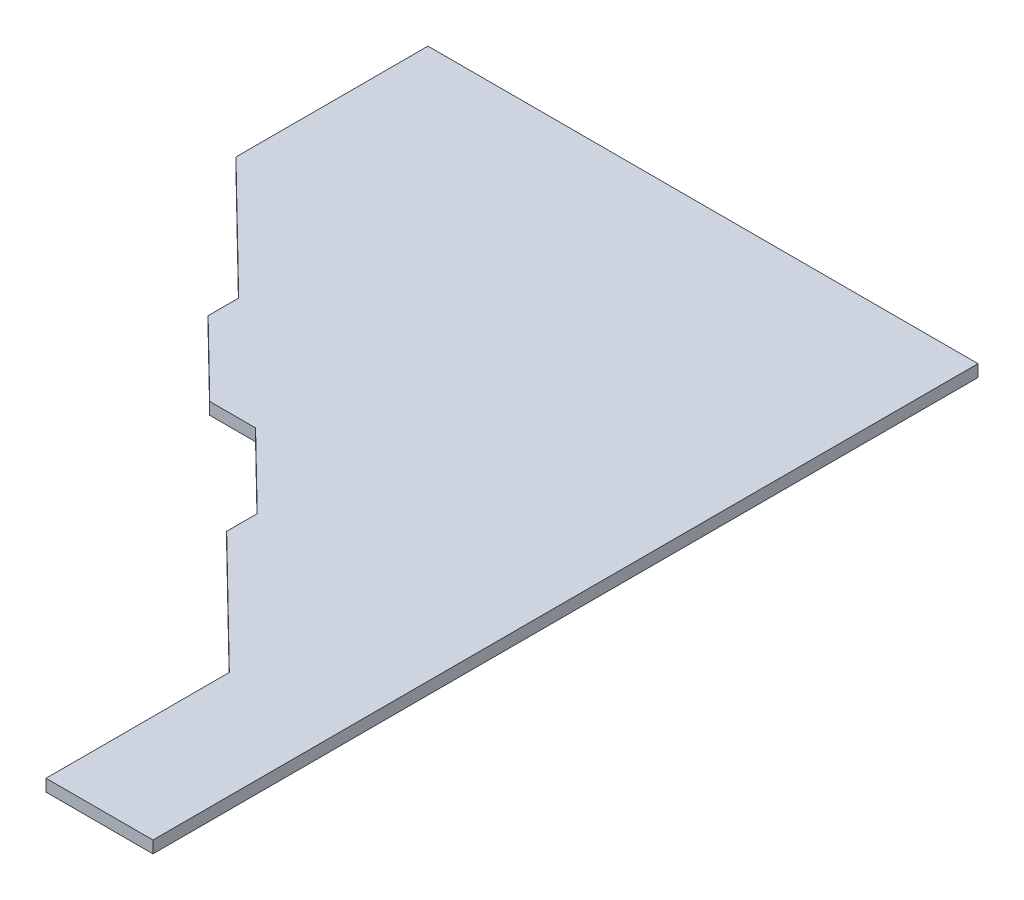
ISO-10303-21;
HEADER;
FILE_DESCRIPTION(('STEP AP214'),'2;1');
FILE_NAME('part.step','',(''),(''),'','','');
FILE_SCHEMA(('AUTOMOTIVE_DESIGN { 1 0 10303 214 1 1 1 1 }'));
ENDSEC;
DATA;
#1=APPLICATION_CONTEXT('core data for automotive mechanical design processes');
#2=APPLICATION_PROTOCOL_DEFINITION('international standard','automotive_design',2000,#1);
#3=PRODUCT_CONTEXT('',#1,'mechanical');
#4=PRODUCT('Part','Part','',(#3));
#5=PRODUCT_RELATED_PRODUCT_CATEGORY('part','',(#4));
#6=PRODUCT_DEFINITION_FORMATION('','',#4);
#7=PRODUCT_DEFINITION_CONTEXT('part definition',#1,'design');
#8=PRODUCT_DEFINITION('design','',#6,#7);
#9=PRODUCT_DEFINITION_SHAPE('','',#8);
#10=(LENGTH_UNIT() NAMED_UNIT(*) SI_UNIT(.MILLI.,.METRE.));
#11=(NAMED_UNIT(*) PLANE_ANGLE_UNIT() SI_UNIT($,.RADIAN.));
#12=(NAMED_UNIT(*) SI_UNIT($,.STERADIAN.) SOLID_ANGLE_UNIT());
#13=UNCERTAINTY_MEASURE_WITH_UNIT(LENGTH_MEASURE(1.E-05),#10,'distance_accuracy_value','');
#14=(GEOMETRIC_REPRESENTATION_CONTEXT(3) GLOBAL_UNCERTAINTY_ASSIGNED_CONTEXT((#13)) GLOBAL_UNIT_ASSIGNED_CONTEXT((#10,
#11,#12)) REPRESENTATION_CONTEXT('',''));
#15=CARTESIAN_POINT('',(0.,0.,0.));
#16=DIRECTION('',(0.,0.,1.));
#17=DIRECTION('',(1.,0.,0.));
#18=AXIS2_PLACEMENT_3D('',#15,#16,#17);
#19=CARTESIAN_POINT('',(-8.89,1.,0.));
#20=DIRECTION('',(0.,0.,-1.));
#21=DIRECTION('',(-1.,0.,0.));
#22=AXIS2_PLACEMENT_3D('',#19,#20,#21);
#23=PLANE('',#22);
#24=DIRECTION('',(1.,0.,0.));
#25=VECTOR('',#24,1.);
#26=CARTESIAN_POINT('',(-8.89,0.,0.));
#27=LINE('',#26,#25);
#28=CARTESIAN_POINT('',(-8.89,0.,0.));
#29=VERTEX_POINT('',#28);
#30=CARTESIAN_POINT('',(0.,0.,0.));
#31=VERTEX_POINT('',#30);
#32=EDGE_CURVE('E164',#29,#31,#27,.T.);
#33=ORIENTED_EDGE('',*,*,#32,.T.);
#34=DIRECTION('',(0.,-1.,0.));
#35=VECTOR('',#34,1.);
#36=CARTESIAN_POINT('',(0.,1.,0.));
#37=LINE('',#36,#35);
#38=CARTESIAN_POINT('',(0.,1.,0.));
#39=VERTEX_POINT('',#38);
#40=EDGE_CURVE('E11',#39,#31,#37,.T.);
#41=ORIENTED_EDGE('',*,*,#40,.F.);
#42=DIRECTION('',(1.,0.,0.));
#43=VECTOR('',#42,1.);
#44=CARTESIAN_POINT('',(-8.89,1.,0.));
#45=LINE('',#44,#43);
#46=CARTESIAN_POINT('',(-8.89,1.,0.));
#47=VERTEX_POINT('',#46);
#48=EDGE_CURVE('E198',#47,#39,#45,.T.);
#49=ORIENTED_EDGE('',*,*,#48,.F.);
#50=DIRECTION('',(0.,-1.,0.));
#51=VECTOR('',#50,1.);
#52=CARTESIAN_POINT('',(-8.89,1.,0.));
#53=LINE('',#52,#51);
#54=EDGE_CURVE('E160',#47,#29,#53,.T.);
#55=ORIENTED_EDGE('',*,*,#54,.T.);
#56=EDGE_LOOP('',(#33,#41,#49,#55));
#57=FACE_BOUND('',#56,.T.);
#58=ADVANCED_FACE('F39',(#57),#23,.F.);
#59=CARTESIAN_POINT('',(0.,1.,0.));
#60=DIRECTION('',(-1.,0.,0.));
#61=DIRECTION('',(0.,0.,1.));
#62=AXIS2_PLACEMENT_3D('',#59,#60,#61);
#63=PLANE('',#62);
#64=DIRECTION('',(0.,0.,-1.));
#65=VECTOR('',#64,1.);
#66=CARTESIAN_POINT('',(0.,0.,0.));
#67=LINE('',#66,#65);
#68=CARTESIAN_POINT('',(0.,0.,-68.58));
#69=VERTEX_POINT('',#68);
#70=EDGE_CURVE('E168',#31,#69,#67,.T.);
#71=ORIENTED_EDGE('',*,*,#70,.T.);
#72=DIRECTION('',(0.,-1.,0.));
#73=VECTOR('',#72,1.);
#74=CARTESIAN_POINT('',(0.,1.,-68.58));
#75=LINE('',#74,#73);
#76=CARTESIAN_POINT('',(0.,1.,-68.58));
#77=VERTEX_POINT('',#76);
#78=EDGE_CURVE('E48',#77,#69,#75,.T.);
#79=ORIENTED_EDGE('',*,*,#78,.F.);
#80=DIRECTION('',(0.,0.,-1.));
#81=VECTOR('',#80,1.);
#82=CARTESIAN_POINT('',(0.,1.,0.));
#83=LINE('',#82,#81);
#84=EDGE_CURVE('E111',#39,#77,#83,.T.);
#85=ORIENTED_EDGE('',*,*,#84,.F.);
#86=ORIENTED_EDGE('',*,*,#40,.T.);
#87=EDGE_LOOP('',(#71,#79,#85,#86));
#88=FACE_BOUND('',#87,.T.);
#89=ADVANCED_FACE('F292',(#88),#63,.F.);
#90=CARTESIAN_POINT('',(0.,1.,-68.58));
#91=DIRECTION('',(0.,0.,1.));
#92=DIRECTION('',(1.,0.,0.));
#93=AXIS2_PLACEMENT_3D('',#90,#91,#92);
#94=PLANE('',#93);
#95=DIRECTION('',(-1.,0.,0.));
#96=VECTOR('',#95,1.);
#97=CARTESIAN_POINT('',(0.,0.,-68.58));
#98=LINE('',#97,#96);
#99=CARTESIAN_POINT('',(-45.72,0.,-68.58));
#100=VERTEX_POINT('',#99);
#101=EDGE_CURVE('E171',#69,#100,#98,.T.);
#102=ORIENTED_EDGE('',*,*,#101,.T.);
#103=DIRECTION('',(0.,-1.,0.));
#104=VECTOR('',#103,1.);
#105=CARTESIAN_POINT('',(-45.72,1.,-68.58));
#106=LINE('',#105,#104);
#107=CARTESIAN_POINT('',(-45.72,1.,-68.58));
#108=VERTEX_POINT('',#107);
#109=EDGE_CURVE('E225',#108,#100,#106,.T.);
#110=ORIENTED_EDGE('',*,*,#109,.F.);
#111=DIRECTION('',(-1.,0.,0.));
#112=VECTOR('',#111,1.);
#113=CARTESIAN_POINT('',(0.,1.,-68.58));
#114=LINE('',#113,#112);
#115=EDGE_CURVE('E235',#77,#108,#114,.T.);
#116=ORIENTED_EDGE('',*,*,#115,.F.);
#117=ORIENTED_EDGE('',*,*,#78,.T.);
#118=EDGE_LOOP('',(#102,#110,#116,#117));
#119=FACE_BOUND('',#118,.T.);
#120=ADVANCED_FACE('F233',(#119),#94,.F.);
#121=CARTESIAN_POINT('',(-45.72,1.,-68.58));
#122=DIRECTION('',(1.,0.,0.));
#123=DIRECTION('',(0.,0.,-1.));
#124=AXIS2_PLACEMENT_3D('',#121,#122,#123);
#125=PLANE('',#124);
#126=DIRECTION('',(0.,0.,1.));
#127=VECTOR('',#126,1.);
#128=CARTESIAN_POINT('',(-45.72,0.,-68.58));
#129=LINE('',#128,#127);
#130=CARTESIAN_POINT('',(-45.72,0.,-52.62));
#131=VERTEX_POINT('',#130);
#132=EDGE_CURVE('E174',#100,#131,#129,.T.);
#133=ORIENTED_EDGE('',*,*,#132,.T.);
#134=DIRECTION('',(0.,-1.,0.));
#135=VECTOR('',#134,1.);
#136=CARTESIAN_POINT('',(-45.72,1.,-52.62));
#137=LINE('',#136,#135);
#138=CARTESIAN_POINT('',(-45.72,1.,-52.62));
#139=VERTEX_POINT('',#138);
#140=EDGE_CURVE('E221',#139,#131,#137,.T.);
#141=ORIENTED_EDGE('',*,*,#140,.F.);
#142=DIRECTION('',(0.,0.,1.));
#143=VECTOR('',#142,1.);
#144=CARTESIAN_POINT('',(-45.72,1.,-68.58));
#145=LINE('',#144,#143);
#146=EDGE_CURVE('E254',#108,#139,#145,.T.);
#147=ORIENTED_EDGE('',*,*,#146,.F.);
#148=ORIENTED_EDGE('',*,*,#109,.T.);
#149=EDGE_LOOP('',(#133,#141,#147,#148));
#150=FACE_BOUND('',#149,.T.);
#151=ADVANCED_FACE('F244',(#150),#125,.F.);
#152=CARTESIAN_POINT('',(-45.72,1.,-52.62));
#153=DIRECTION('',(0.699270106177688,0.,-0.714857551268954));
#154=DIRECTION('',(-0.714857551268954,0.,-0.699270106177688));
#155=AXIS2_PLACEMENT_3D('',#152,#153,#154);
#156=PLANE('',#155);
#157=DIRECTION('',(0.714857551268954,0.,0.699270106177688));
#158=VECTOR('',#157,1.);
#159=CARTESIAN_POINT('',(-45.72,0.,-52.62));
#160=LINE('',#159,#158);
#161=CARTESIAN_POINT('',(-35.4489267033677,0.,-42.572887114439));
#162=VERTEX_POINT('',#161);
#163=EDGE_CURVE('E177',#131,#162,#160,.T.);
#164=ORIENTED_EDGE('',*,*,#163,.T.);
#165=DIRECTION('',(0.,-1.,0.));
#166=VECTOR('',#165,1.);
#167=CARTESIAN_POINT('',(-35.4489267033677,1.,-42.572887114439));
#168=LINE('',#167,#166);
#169=CARTESIAN_POINT('',(-35.4489267033677,1.,-42.572887114439));
#170=VERTEX_POINT('',#169);
#171=EDGE_CURVE('E217',#170,#162,#168,.T.);
#172=ORIENTED_EDGE('',*,*,#171,.F.);
#173=DIRECTION('',(0.714857551268954,0.,0.699270106177688));
#174=VECTOR('',#173,1.);
#175=CARTESIAN_POINT('',(-45.72,1.,-52.62));
#176=LINE('',#175,#174);
#177=EDGE_CURVE('E250',#139,#170,#176,.T.);
#178=ORIENTED_EDGE('',*,*,#177,.F.);
#179=ORIENTED_EDGE('',*,*,#140,.T.);
#180=EDGE_LOOP('',(#164,#172,#178,#179));
#181=FACE_BOUND('',#180,.T.);
#182=ADVANCED_FACE('F248',(#181),#156,.F.);
#183=CARTESIAN_POINT('',(-35.4489267033677,1.,-42.572887114439));
#184=DIRECTION('',(1.,0.,0.));
#185=DIRECTION('',(0.,0.,-1.));
#186=AXIS2_PLACEMENT_3D('',#183,#184,#185);
#187=PLANE('',#186);
#188=DIRECTION('',(0.,0.,1.));
#189=VECTOR('',#188,1.);
#190=CARTESIAN_POINT('',(-35.4489267033677,0.,-42.572887114439));
#191=LINE('',#190,#189);
#192=CARTESIAN_POINT('',(-35.4489267033677,0.,-40.032887114439));
#193=VERTEX_POINT('',#192);
#194=EDGE_CURVE('E180',#162,#193,#191,.T.);
#195=ORIENTED_EDGE('',*,*,#194,.T.);
#196=DIRECTION('',(0.,-1.,0.));
#197=VECTOR('',#196,1.);
#198=CARTESIAN_POINT('',(-35.4489267033677,1.,-40.032887114439));
#199=LINE('',#198,#197);
#200=CARTESIAN_POINT('',(-35.4489267033677,1.,-40.032887114439));
#201=VERTEX_POINT('',#200);
#202=EDGE_CURVE('E213',#201,#193,#199,.T.);
#203=ORIENTED_EDGE('',*,*,#202,.F.);
#204=DIRECTION('',(0.,0.,1.));
#205=VECTOR('',#204,1.);
#206=CARTESIAN_POINT('',(-35.4489267033677,1.,-42.572887114439));
#207=LINE('',#206,#205);
#208=EDGE_CURVE('E253',#170,#201,#207,.T.);
#209=ORIENTED_EDGE('',*,*,#208,.F.);
#210=ORIENTED_EDGE('',*,*,#171,.T.);
#211=EDGE_LOOP('',(#195,#203,#209,#210));
#212=FACE_BOUND('',#211,.T.);
#213=ADVANCED_FACE('F305',(#212),#187,.F.);
#214=CARTESIAN_POINT('',(-35.4489267033677,1.,-40.032887114439));
#215=DIRECTION('',(0.699270106177687,0.,-0.714857551268955));
#216=DIRECTION('',(-0.714857551268955,0.,-0.699270106177687));
#217=AXIS2_PLACEMENT_3D('',#214,#215,#216);
#218=PLANE('',#217);
#219=DIRECTION('',(0.714857551268955,0.,0.699270106177687));
#220=VECTOR('',#219,1.);
#221=CARTESIAN_POINT('',(-35.4489267033677,0.,-40.032887114439));
#222=LINE('',#221,#220);
#223=CARTESIAN_POINT('',(-29.21,0.,-33.93));
#224=VERTEX_POINT('',#223);
#225=EDGE_CURVE('E183',#193,#224,#222,.T.);
#226=ORIENTED_EDGE('',*,*,#225,.T.);
#227=DIRECTION('',(0.,-1.,0.));
#228=VECTOR('',#227,1.);
#229=CARTESIAN_POINT('',(-29.21,1.,-33.93));
#230=LINE('',#229,#228);
#231=CARTESIAN_POINT('',(-29.21,1.,-33.93));
#232=VERTEX_POINT('',#231);
#233=EDGE_CURVE('E209',#232,#224,#230,.T.);
#234=ORIENTED_EDGE('',*,*,#233,.F.);
#235=DIRECTION('',(0.714857551268955,0.,0.699270106177687));
#236=VECTOR('',#235,1.);
#237=CARTESIAN_POINT('',(-35.4489267033677,1.,-40.032887114439));
#238=LINE('',#237,#236);
#239=EDGE_CURVE('E258',#201,#232,#238,.T.);
#240=ORIENTED_EDGE('',*,*,#239,.F.);
#241=ORIENTED_EDGE('',*,*,#202,.T.);
#242=EDGE_LOOP('',(#226,#234,#240,#241));
#243=FACE_BOUND('',#242,.T.);
#244=ADVANCED_FACE('F308',(#243),#218,.F.);
#245=CARTESIAN_POINT('',(-29.21,1.,-33.93));
#246=DIRECTION('',(0.,0.,-1.));
#247=DIRECTION('',(-1.,0.,0.));
#248=AXIS2_PLACEMENT_3D('',#245,#246,#247);
#249=PLANE('',#248);
#250=DIRECTION('',(1.,0.,0.));
#251=VECTOR('',#250,1.);
#252=CARTESIAN_POINT('',(-29.21,0.,-33.93));
#253=LINE('',#252,#251);
#254=CARTESIAN_POINT('',(-25.4,0.,-33.93));
#255=VERTEX_POINT('',#254);
#256=EDGE_CURVE('E186',#224,#255,#253,.T.);
#257=ORIENTED_EDGE('',*,*,#256,.T.);
#258=DIRECTION('',(0.,-1.,0.));
#259=VECTOR('',#258,1.);
#260=CARTESIAN_POINT('',(-25.4,1.,-33.93));
#261=LINE('',#260,#259);
#262=CARTESIAN_POINT('',(-25.4,1.,-33.93));
#263=VERTEX_POINT('',#262);
#264=EDGE_CURVE('E205',#263,#255,#261,.T.);
#265=ORIENTED_EDGE('',*,*,#264,.F.);
#266=DIRECTION('',(1.,0.,0.));
#267=VECTOR('',#266,1.);
#268=CARTESIAN_POINT('',(-29.21,1.,-33.93));
#269=LINE('',#268,#267);
#270=EDGE_CURVE('E265',#232,#263,#269,.T.);
#271=ORIENTED_EDGE('',*,*,#270,.F.);
#272=ORIENTED_EDGE('',*,*,#233,.T.);
#273=EDGE_LOOP('',(#257,#265,#271,#272));
#274=FACE_BOUND('',#273,.T.);
#275=ADVANCED_FACE('F273',(#274),#249,.F.);
#276=CARTESIAN_POINT('',(-25.4,1.,-33.93));
#277=DIRECTION('',(0.699270106177688,0.,-0.714857551268954));
#278=DIRECTION('',(-0.714857551268954,0.,-0.699270106177688));
#279=AXIS2_PLACEMENT_3D('',#276,#277,#278);
#280=PLANE('',#279);
#281=DIRECTION('',(0.714857551268954,0.,0.699270106177688));
#282=VECTOR('',#281,1.);
#283=CARTESIAN_POINT('',(-25.4,0.,-33.93));
#284=LINE('',#283,#282);
#285=CARTESIAN_POINT('',(-19.1610732966323,0.,-27.827112885561));
#286=VERTEX_POINT('',#285);
#287=EDGE_CURVE('E189',#255,#286,#284,.T.);
#288=ORIENTED_EDGE('',*,*,#287,.T.);
#289=DIRECTION('',(0.,-1.,0.));
#290=VECTOR('',#289,1.);
#291=CARTESIAN_POINT('',(-19.1610732966323,1.,-27.827112885561));
#292=LINE('',#291,#290);
#293=CARTESIAN_POINT('',(-19.1610732966323,1.,-27.827112885561));
#294=VERTEX_POINT('',#293);
#295=EDGE_CURVE('E153',#294,#286,#292,.T.);
#296=ORIENTED_EDGE('',*,*,#295,.F.);
#297=DIRECTION('',(0.714857551268954,0.,0.699270106177688));
#298=VECTOR('',#297,1.);
#299=CARTESIAN_POINT('',(-25.4,1.,-33.93));
#300=LINE('',#299,#298);
#301=EDGE_CURVE('E142',#263,#294,#300,.T.);
#302=ORIENTED_EDGE('',*,*,#301,.F.);
#303=ORIENTED_EDGE('',*,*,#264,.T.);
#304=EDGE_LOOP('',(#288,#296,#302,#303));
#305=FACE_BOUND('',#304,.T.);
#306=ADVANCED_FACE('F277',(#305),#280,.F.);
#307=CARTESIAN_POINT('',(-19.1610732966323,1.,-27.827112885561));
#308=DIRECTION('',(1.,0.,0.));
#309=DIRECTION('',(0.,0.,-1.));
#310=AXIS2_PLACEMENT_3D('',#307,#308,#309);
#311=PLANE('',#310);
#312=DIRECTION('',(0.,0.,1.));
#313=VECTOR('',#312,1.);
#314=CARTESIAN_POINT('',(-19.1610732966323,0.,-27.827112885561));
#315=LINE('',#314,#313);
#316=CARTESIAN_POINT('',(-19.1610732966323,0.,-25.287112885561));
#317=VERTEX_POINT('',#316);
#318=EDGE_CURVE('E151',#286,#317,#315,.T.);
#319=ORIENTED_EDGE('',*,*,#318,.T.);
#320=DIRECTION('',(0.,-1.,0.));
#321=VECTOR('',#320,1.);
#322=CARTESIAN_POINT('',(-19.1610732966323,1.,-25.287112885561));
#323=LINE('',#322,#321);
#324=CARTESIAN_POINT('',(-19.1610732966323,1.,-25.287112885561));
#325=VERTEX_POINT('',#324);
#326=EDGE_CURVE('E148',#325,#317,#323,.T.);
#327=ORIENTED_EDGE('',*,*,#326,.F.);
#328=DIRECTION('',(0.,0.,1.));
#329=VECTOR('',#328,1.);
#330=CARTESIAN_POINT('',(-19.1610732966323,1.,-27.827112885561));
#331=LINE('',#330,#329);
#332=EDGE_CURVE('E136',#294,#325,#331,.T.);
#333=ORIENTED_EDGE('',*,*,#332,.F.);
#334=ORIENTED_EDGE('',*,*,#295,.T.);
#335=EDGE_LOOP('',(#319,#327,#333,#334));
#336=FACE_BOUND('',#335,.T.);
#337=ADVANCED_FACE('F149',(#336),#311,.F.);
#338=CARTESIAN_POINT('',(-19.1610732966323,1.,-25.287112885561));
#339=DIRECTION('',(0.699270106177687,0.,-0.714857551268955));
#340=DIRECTION('',(-0.714857551268955,0.,-0.699270106177687));
#341=AXIS2_PLACEMENT_3D('',#338,#339,#340);
#342=PLANE('',#341);
#343=DIRECTION('',(0.714857551268955,0.,0.699270106177687));
#344=VECTOR('',#343,1.);
#345=CARTESIAN_POINT('',(-19.1610732966323,0.,-25.287112885561));
#346=LINE('',#345,#344);
#347=CARTESIAN_POINT('',(-8.89,0.,-15.24));
#348=VERTEX_POINT('',#347);
#349=EDGE_CURVE('E97',#317,#348,#346,.T.);
#350=ORIENTED_EDGE('',*,*,#349,.T.);
#351=DIRECTION('',(0.,-1.,0.));
#352=VECTOR('',#351,1.);
#353=CARTESIAN_POINT('',(-8.89,1.,-15.24));
#354=LINE('',#353,#352);
#355=CARTESIAN_POINT('',(-8.89,1.,-15.24));
#356=VERTEX_POINT('',#355);
#357=EDGE_CURVE('E154',#356,#348,#354,.T.);
#358=ORIENTED_EDGE('',*,*,#357,.F.);
#359=DIRECTION('',(0.714857551268955,0.,0.699270106177687));
#360=VECTOR('',#359,1.);
#361=CARTESIAN_POINT('',(-19.1610732966323,1.,-25.287112885561));
#362=LINE('',#361,#360);
#363=EDGE_CURVE('E140',#325,#356,#362,.T.);
#364=ORIENTED_EDGE('',*,*,#363,.F.);
#365=ORIENTED_EDGE('',*,*,#326,.T.);
#366=EDGE_LOOP('',(#350,#358,#364,#365));
#367=FACE_BOUND('',#366,.T.);
#368=ADVANCED_FACE('F156',(#367),#342,.F.);
#369=CARTESIAN_POINT('',(-8.89,1.,-15.24));
#370=DIRECTION('',(1.,0.,0.));
#371=DIRECTION('',(0.,0.,-1.));
#372=AXIS2_PLACEMENT_3D('',#369,#370,#371);
#373=PLANE('',#372);
#374=DIRECTION('',(0.,0.,1.));
#375=VECTOR('',#374,1.);
#376=CARTESIAN_POINT('',(-8.89,0.,-15.24));
#377=LINE('',#376,#375);
#378=EDGE_CURVE('E103',#348,#29,#377,.T.);
#379=ORIENTED_EDGE('',*,*,#378,.T.);
#380=ORIENTED_EDGE('',*,*,#54,.F.);
#381=DIRECTION('',(0.,0.,1.));
#382=VECTOR('',#381,1.);
#383=CARTESIAN_POINT('',(-8.89,1.,-15.24));
#384=LINE('',#383,#382);
#385=EDGE_CURVE('E56',#356,#47,#384,.T.);
#386=ORIENTED_EDGE('',*,*,#385,.F.);
#387=ORIENTED_EDGE('',*,*,#357,.T.);
#388=EDGE_LOOP('',(#379,#380,#386,#387));
#389=FACE_BOUND('',#388,.T.);
#390=ADVANCED_FACE('F281',(#389),#373,.F.);
#391=CARTESIAN_POINT('',(0.,1.,0.));
#392=DIRECTION('',(0.,1.,0.));
#393=DIRECTION('',(0.,0.,1.));
#394=AXIS2_PLACEMENT_3D('',#391,#392,#393);
#395=PLANE('',#394);
#396=ORIENTED_EDGE('',*,*,#48,.T.);
#397=ORIENTED_EDGE('',*,*,#84,.T.);
#398=ORIENTED_EDGE('',*,*,#115,.T.);
#399=ORIENTED_EDGE('',*,*,#146,.T.);
#400=ORIENTED_EDGE('',*,*,#177,.T.);
#401=ORIENTED_EDGE('',*,*,#208,.T.);
#402=ORIENTED_EDGE('',*,*,#239,.T.);
#403=ORIENTED_EDGE('',*,*,#270,.T.);
#404=ORIENTED_EDGE('',*,*,#301,.T.);
#405=ORIENTED_EDGE('',*,*,#332,.T.);
#406=ORIENTED_EDGE('',*,*,#363,.T.);
#407=ORIENTED_EDGE('',*,*,#385,.T.);
#408=EDGE_LOOP('',(#396,#397,#398,#399,#400,#401,#402,#403,#404,#405,#406,#407));
#409=FACE_BOUND('',#408,.T.);
#410=ADVANCED_FACE('F138',(#409),#395,.T.);
#411=CARTESIAN_POINT('',(0.,0.,0.));
#412=DIRECTION('',(0.,1.,0.));
#413=DIRECTION('',(0.,0.,1.));
#414=AXIS2_PLACEMENT_3D('',#411,#412,#413);
#415=PLANE('',#414);
#416=ORIENTED_EDGE('',*,*,#32,.F.);
#417=ORIENTED_EDGE('',*,*,#378,.F.);
#418=ORIENTED_EDGE('',*,*,#349,.F.);
#419=ORIENTED_EDGE('',*,*,#318,.F.);
#420=ORIENTED_EDGE('',*,*,#287,.F.);
#421=ORIENTED_EDGE('',*,*,#256,.F.);
#422=ORIENTED_EDGE('',*,*,#225,.F.);
#423=ORIENTED_EDGE('',*,*,#194,.F.);
#424=ORIENTED_EDGE('',*,*,#163,.F.);
#425=ORIENTED_EDGE('',*,*,#132,.F.);
#426=ORIENTED_EDGE('',*,*,#101,.F.);
#427=ORIENTED_EDGE('',*,*,#70,.F.);
#428=EDGE_LOOP('',(#416,#417,#418,#419,#420,#421,#422,#423,#424,#425,#426,#427));
#429=FACE_BOUND('',#428,.T.);
#430=ADVANCED_FACE('F239',(#429),#415,.F.);
#431=CLOSED_SHELL('',(#58,#89,#120,#151,#182,#213,#244,#275,#306,#337,#368,#390,#410,#430));
#432=MANIFOLD_SOLID_BREP('B2',#431);
#433=ADVANCED_BREP_SHAPE_REPRESENTATION('',(#18,#432),#14);
#434=SHAPE_DEFINITION_REPRESENTATION(#9,#433);
ENDSEC;
END-ISO-10303-21;
